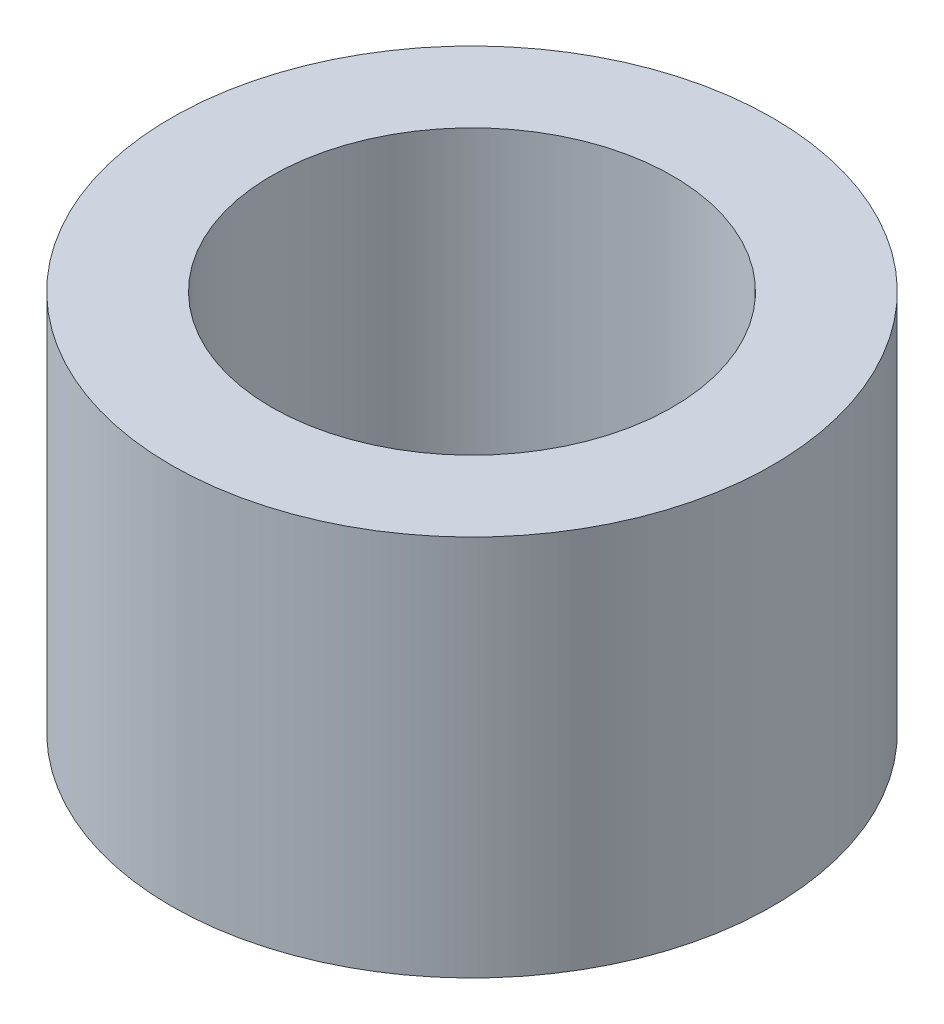
ISO-10303-21;
HEADER;
FILE_DESCRIPTION(('STEP AP214'),'2;1');
FILE_NAME('part.step','',(''),(''),'','','');
FILE_SCHEMA(('AUTOMOTIVE_DESIGN { 1 0 10303 214 1 1 1 1 }'));
ENDSEC;
DATA;
#1=APPLICATION_CONTEXT('core data for automotive mechanical design processes');
#2=APPLICATION_PROTOCOL_DEFINITION('international standard','automotive_design',2000,#1);
#3=PRODUCT_CONTEXT('',#1,'mechanical');
#4=PRODUCT('Part','Part','',(#3));
#5=PRODUCT_RELATED_PRODUCT_CATEGORY('part','',(#4));
#6=PRODUCT_DEFINITION_FORMATION('','',#4);
#7=PRODUCT_DEFINITION_CONTEXT('part definition',#1,'design');
#8=PRODUCT_DEFINITION('design','',#6,#7);
#9=PRODUCT_DEFINITION_SHAPE('','',#8);
#10=(LENGTH_UNIT() NAMED_UNIT(*) SI_UNIT(.MILLI.,.METRE.));
#11=(NAMED_UNIT(*) PLANE_ANGLE_UNIT() SI_UNIT($,.RADIAN.));
#12=(NAMED_UNIT(*) SI_UNIT($,.STERADIAN.) SOLID_ANGLE_UNIT());
#13=UNCERTAINTY_MEASURE_WITH_UNIT(LENGTH_MEASURE(1.E-05),#10,'distance_accuracy_value','');
#14=(GEOMETRIC_REPRESENTATION_CONTEXT(3) GLOBAL_UNCERTAINTY_ASSIGNED_CONTEXT((#13)) GLOBAL_UNIT_ASSIGNED_CONTEXT((#10,
#11,#12)) REPRESENTATION_CONTEXT('',''));
#15=CARTESIAN_POINT('',(0.,0.,0.));
#16=DIRECTION('',(0.,0.,1.));
#17=DIRECTION('',(1.,0.,0.));
#18=AXIS2_PLACEMENT_3D('',#15,#16,#17);
#19=CARTESIAN_POINT('',(0.,4.,0.));
#20=DIRECTION('',(0.,-1.,0.));
#21=DIRECTION('',(0.,0.,-1.));
#22=AXIS2_PLACEMENT_3D('',#19,#20,#21);
#23=CYLINDRICAL_SURFACE('',#22,2.1);
#24=CARTESIAN_POINT('',(0.,4.,0.));
#25=DIRECTION('',(0.,1.,0.));
#26=DIRECTION('',(0.,0.,1.));
#27=AXIS2_PLACEMENT_3D('',#24,#25,#26);
#28=CIRCLE('',#27,2.1);
#29=CARTESIAN_POINT('',(0.,4.,2.1));
#30=VERTEX_POINT('',#29);
#31=EDGE_CURVE('E42',#30,#30,#28,.T.);
#32=ORIENTED_EDGE('',*,*,#31,.T.);
#33=EDGE_LOOP('',(#32));
#34=FACE_BOUND('',#33,.T.);
#35=CARTESIAN_POINT('',(0.,0.,0.));
#36=DIRECTION('',(0.,1.,0.));
#37=DIRECTION('',(0.,0.,1.));
#38=AXIS2_PLACEMENT_3D('',#35,#36,#37);
#39=CIRCLE('',#38,2.1);
#40=CARTESIAN_POINT('',(0.,0.,2.1));
#41=VERTEX_POINT('',#40);
#42=EDGE_CURVE('E48',#41,#41,#39,.T.);
#43=ORIENTED_EDGE('',*,*,#42,.F.);
#44=EDGE_LOOP('',(#43));
#45=FACE_BOUND('',#44,.T.);
#46=ADVANCED_FACE('F35',(#34,#45),#23,.F.);
#47=CARTESIAN_POINT('',(0.,4.,0.));
#48=DIRECTION('',(0.,-1.,0.));
#49=DIRECTION('',(0.,0.,-1.));
#50=AXIS2_PLACEMENT_3D('',#47,#48,#49);
#51=CYLINDRICAL_SURFACE('',#50,3.15);
#52=CARTESIAN_POINT('',(0.,4.,0.));
#53=DIRECTION('',(0.,1.,0.));
#54=DIRECTION('',(0.,0.,1.));
#55=AXIS2_PLACEMENT_3D('',#52,#53,#54);
#56=CIRCLE('',#55,3.15);
#57=CARTESIAN_POINT('',(0.,4.,3.15));
#58=VERTEX_POINT('',#57);
#59=EDGE_CURVE('E10',#58,#58,#56,.T.);
#60=ORIENTED_EDGE('',*,*,#59,.F.);
#61=EDGE_LOOP('',(#60));
#62=FACE_BOUND('',#61,.T.);
#63=CARTESIAN_POINT('',(0.,0.,0.));
#64=DIRECTION('',(0.,1.,0.));
#65=DIRECTION('',(0.,0.,1.));
#66=AXIS2_PLACEMENT_3D('',#63,#64,#65);
#67=CIRCLE('',#66,3.15);
#68=CARTESIAN_POINT('',(0.,0.,3.15));
#69=VERTEX_POINT('',#68);
#70=EDGE_CURVE('E38',#69,#69,#67,.T.);
#71=ORIENTED_EDGE('',*,*,#70,.T.);
#72=EDGE_LOOP('',(#71));
#73=FACE_BOUND('',#72,.T.);
#74=ADVANCED_FACE('F55',(#62,#73),#51,.T.);
#75=CARTESIAN_POINT('',(0.,4.,0.));
#76=DIRECTION('',(0.,1.,0.));
#77=DIRECTION('',(0.,0.,1.));
#78=AXIS2_PLACEMENT_3D('',#75,#76,#77);
#79=PLANE('',#78);
#80=ORIENTED_EDGE('',*,*,#31,.F.);
#81=EDGE_LOOP('',(#80));
#82=FACE_BOUND('',#81,.T.);
#83=ORIENTED_EDGE('',*,*,#59,.T.);
#84=EDGE_LOOP('',(#83));
#85=FACE_BOUND('',#84,.T.);
#86=ADVANCED_FACE('F59',(#82,#85),#79,.T.);
#87=CARTESIAN_POINT('',(0.,0.,0.));
#88=DIRECTION('',(0.,1.,0.));
#89=DIRECTION('',(0.,0.,1.));
#90=AXIS2_PLACEMENT_3D('',#87,#88,#89);
#91=PLANE('',#90);
#92=ORIENTED_EDGE('',*,*,#42,.T.);
#93=EDGE_LOOP('',(#92));
#94=FACE_BOUND('',#93,.T.);
#95=ORIENTED_EDGE('',*,*,#70,.F.);
#96=EDGE_LOOP('',(#95));
#97=FACE_BOUND('',#96,.T.);
#98=ADVANCED_FACE('F57',(#94,#97),#91,.F.);
#99=CLOSED_SHELL('',(#46,#74,#86,#98));
#100=MANIFOLD_SOLID_BREP('B2',#99);
#101=ADVANCED_BREP_SHAPE_REPRESENTATION('',(#18,#100),#14);
#102=SHAPE_DEFINITION_REPRESENTATION(#9,#101);
ENDSEC;
END-ISO-10303-21;
